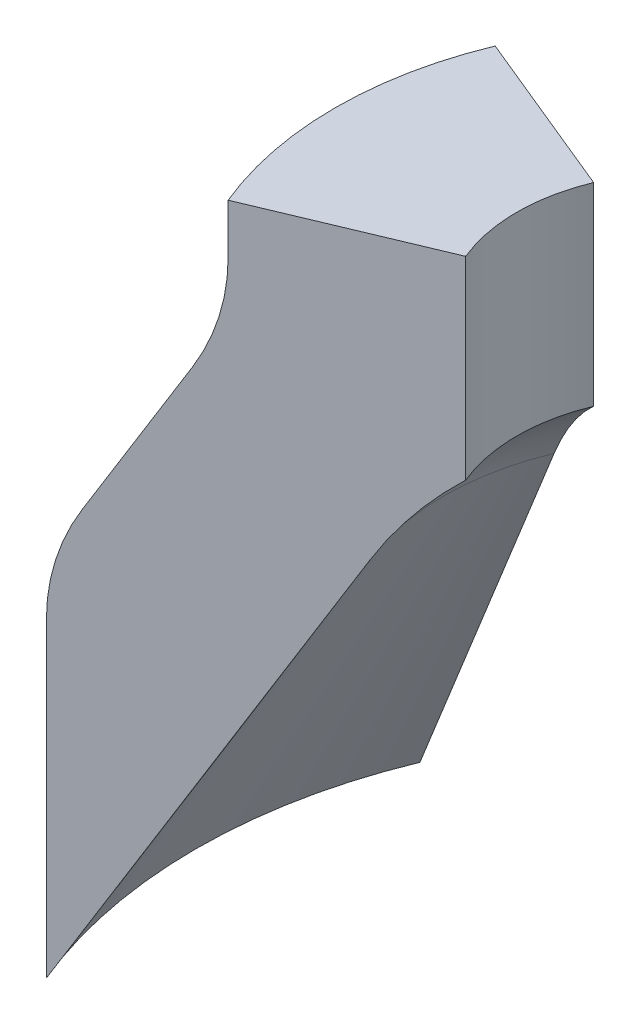
ISO-10303-21;
HEADER;
FILE_DESCRIPTION(('STEP AP214'),'2;1');
FILE_NAME('part.step','',(''),(''),'','','');
FILE_SCHEMA(('AUTOMOTIVE_DESIGN { 1 0 10303 214 1 1 1 1 }'));
ENDSEC;
DATA;
#1=APPLICATION_CONTEXT('core data for automotive mechanical design processes');
#2=APPLICATION_PROTOCOL_DEFINITION('international standard','automotive_design',2000,#1);
#3=PRODUCT_CONTEXT('',#1,'mechanical');
#4=PRODUCT('Part','Part','',(#3));
#5=PRODUCT_RELATED_PRODUCT_CATEGORY('part','',(#4));
#6=PRODUCT_DEFINITION_FORMATION('','',#4);
#7=PRODUCT_DEFINITION_CONTEXT('part definition',#1,'design');
#8=PRODUCT_DEFINITION('design','',#6,#7);
#9=PRODUCT_DEFINITION_SHAPE('','',#8);
#10=(LENGTH_UNIT() NAMED_UNIT(*) SI_UNIT(.MILLI.,.METRE.));
#11=(NAMED_UNIT(*) PLANE_ANGLE_UNIT() SI_UNIT($,.RADIAN.));
#12=(NAMED_UNIT(*) SI_UNIT($,.STERADIAN.) SOLID_ANGLE_UNIT());
#13=UNCERTAINTY_MEASURE_WITH_UNIT(LENGTH_MEASURE(1.E-05),#10,'distance_accuracy_value','');
#14=(GEOMETRIC_REPRESENTATION_CONTEXT(3) GLOBAL_UNCERTAINTY_ASSIGNED_CONTEXT((#13)) GLOBAL_UNIT_ASSIGNED_CONTEXT((#10,
#11,#12)) REPRESENTATION_CONTEXT('',''));
#15=CARTESIAN_POINT('',(0.,0.,0.));
#16=DIRECTION('',(0.,0.,1.));
#17=DIRECTION('',(1.,0.,0.));
#18=AXIS2_PLACEMENT_3D('',#15,#16,#17);
#19=CARTESIAN_POINT('',(0.,18.1196214310934,0.));
#20=DIRECTION('',(0.,1.,0.));
#21=DIRECTION('',(-1.,0.,0.));
#22=AXIS2_PLACEMENT_3D('',#19,#20,#21);
#23=TOROIDAL_SURFACE('',#22,29.7610646475562,11.);
#24=CARTESIAN_POINT('',(0.,12.6206719069507,0.));
#25=DIRECTION('',(0.,1.,0.));
#26=DIRECTION('',(-1.,0.,0.));
#27=AXIS2_PLACEMENT_3D('',#24,#25,#26);
#28=CIRCLE('',#27,20.2341787906284);
#29=CARTESIAN_POINT('',(-18.6939436418356,12.6206719069507,-7.74328499068661));
#30=VERTEX_POINT('',#29);
#31=CARTESIAN_POINT('',(-18.6939436418356,12.6206719069507,7.74328499068661));
#32=VERTEX_POINT('',#31);
#33=EDGE_CURVE('E358',#30,#32,#28,.T.);
#34=ORIENTED_EDGE('',*,*,#33,.T.);
#35=CARTESIAN_POINT('',(-27.4956384936224,18.1196214310934,11.3890663701662));
#36=DIRECTION('',(-0.382683432365091,0.,-0.923879532511287));
#37=DIRECTION('',(-0.923879532511287,0.,0.382683432365091));
#38=AXIS2_PLACEMENT_3D('',#35,#36,#37);
#39=CIRCLE('',#38,11.);
#40=CARTESIAN_POINT('',(-17.3329636359983,18.1196214310934,7.17954861415018));
#41=VERTEX_POINT('',#40);
#42=EDGE_CURVE('E290',#41,#32,#39,.T.);
#43=ORIENTED_EDGE('',*,*,#42,.F.);
#44=CARTESIAN_POINT('',(0.,18.1196214310934,0.));
#45=DIRECTION('',(0.,1.,0.));
#46=DIRECTION('',(-1.,0.,0.));
#47=AXIS2_PLACEMENT_3D('',#44,#45,#46);
#48=CIRCLE('',#47,18.7610646475562);
#49=CARTESIAN_POINT('',(-17.3329636359983,18.1196214310934,-7.17954861415018));
#50=VERTEX_POINT('',#49);
#51=EDGE_CURVE('E63',#50,#41,#48,.T.);
#52=ORIENTED_EDGE('',*,*,#51,.F.);
#53=CARTESIAN_POINT('',(-27.4956384936224,18.1196214310934,-11.3890663701662));
#54=DIRECTION('',(0.382683432365091,0.,-0.923879532511287));
#55=DIRECTION('',(-0.923879532511287,0.,-0.382683432365091));
#56=AXIS2_PLACEMENT_3D('',#53,#54,#55);
#57=CIRCLE('',#56,11.);
#58=EDGE_CURVE('E317',#50,#30,#57,.T.);
#59=ORIENTED_EDGE('',*,*,#58,.T.);
#60=EDGE_LOOP('',(#34,#43,#52,#59));
#61=FACE_BOUND('',#60,.T.);
#62=ADVANCED_FACE('F36',(#61),#23,.F.);
#63=CARTESIAN_POINT('',(0.,12.6206719069507,0.));
#64=DIRECTION('',(0.,-1.,0.));
#65=DIRECTION('',(1.,0.,0.));
#66=AXIS2_PLACEMENT_3D('',#63,#64,#65);
#67=CONICAL_SURFACE('',#66,20.2341787906284,0.523488507740986);
#68=CARTESIAN_POINT('',(0.,4.76781118512612,0.));
#69=DIRECTION('',(0.,1.,0.));
#70=DIRECTION('',(-1.,0.,0.));
#71=AXIS2_PLACEMENT_3D('',#68,#69,#70);
#72=CIRCLE('',#71,24.7668755582752);
#73=CARTESIAN_POINT('',(-22.8816094125445,4.76781118512613,-9.47787294759981));
#74=VERTEX_POINT('',#73);
#75=CARTESIAN_POINT('',(-22.8816094125445,4.76781118512613,9.47787294759981));
#76=VERTEX_POINT('',#75);
#77=EDGE_CURVE('E356',#74,#76,#72,.T.);
#78=ORIENTED_EDGE('',*,*,#77,.T.);
#79=DIRECTION('',(-0.461851537788009,-0.866080532447982,0.191305170754664));
#80=VECTOR('',#79,1.);
#81=CARTESIAN_POINT('',(-22.8816094125445,4.76781118512613,9.47787294759981));
#82=LINE('',#81,#80);
#83=EDGE_CURVE('E293',#32,#76,#82,.T.);
#84=ORIENTED_EDGE('',*,*,#83,.F.);
#85=ORIENTED_EDGE('',*,*,#33,.F.);
#86=DIRECTION('',(-0.461851537788009,-0.866080532447982,-0.191305170754664));
#87=VECTOR('',#86,1.);
#88=CARTESIAN_POINT('',(-22.8816094125445,4.76781118512613,-9.47787294759981));
#89=LINE('',#88,#87);
#90=EDGE_CURVE('E319',#30,#74,#89,.T.);
#91=ORIENTED_EDGE('',*,*,#90,.T.);
#92=EDGE_LOOP('',(#78,#84,#85,#91));
#93=FACE_BOUND('',#92,.T.);
#94=ADVANCED_FACE('F38',(#93),#67,.T.);
#95=CARTESIAN_POINT('',(0.,-0.73113833901656,0.));
#96=DIRECTION('',(0.,1.,0.));
#97=DIRECTION('',(-1.,0.,0.));
#98=AXIS2_PLACEMENT_3D('',#95,#96,#97);
#99=TOROIDAL_SURFACE('',#98,15.2399897013474,11.);
#100=CARTESIAN_POINT('',(0.,-0.731138339016564,0.));
#101=DIRECTION('',(0.,1.,0.));
#102=DIRECTION('',(-1.,0.,0.));
#103=AXIS2_PLACEMENT_3D('',#100,#101,#102);
#104=CIRCLE('',#103,26.2399897013474);
#105=CARTESIAN_POINT('',(-24.2425894183818,-0.731138339016556,-10.0416093241362));
#106=VERTEX_POINT('',#105);
#107=CARTESIAN_POINT('',(-24.2425894183818,-0.731138339016556,10.0416093241362));
#108=VERTEX_POINT('',#107);
#109=EDGE_CURVE('E354',#106,#108,#104,.T.);
#110=ORIENTED_EDGE('',*,*,#109,.T.);
#111=CARTESIAN_POINT('',(-14.0799145607576,-0.731138339016556,5.83209156812024));
#112=DIRECTION('',(0.382683432365091,0.,0.923879532511287));
#113=DIRECTION('',(0.923879532511287,0.,-0.382683432365091));
#114=AXIS2_PLACEMENT_3D('',#111,#112,#113);
#115=CIRCLE('',#114,11.);
#116=EDGE_CURVE('E296',#76,#108,#115,.T.);
#117=ORIENTED_EDGE('',*,*,#116,.F.);
#118=ORIENTED_EDGE('',*,*,#77,.F.);
#119=CARTESIAN_POINT('',(-14.0799145607576,-0.731138339016556,-5.83209156812024));
#120=DIRECTION('',(-0.382683432365091,0.,0.923879532511287));
#121=DIRECTION('',(0.923879532511287,0.,0.382683432365091));
#122=AXIS2_PLACEMENT_3D('',#119,#120,#121);
#123=CIRCLE('',#122,11.);
#124=EDGE_CURVE('E322',#74,#106,#123,.T.);
#125=ORIENTED_EDGE('',*,*,#124,.T.);
#126=EDGE_LOOP('',(#110,#117,#118,#125));
#127=FACE_BOUND('',#126,.T.);
#128=ADVANCED_FACE('F516',(#127),#99,.T.);
#129=CARTESIAN_POINT('',(0.,0.,0.));
#130=DIRECTION('',(0.,1.,0.));
#131=DIRECTION('',(-1.,0.,0.));
#132=AXIS2_PLACEMENT_3D('',#129,#130,#131);
#133=CYLINDRICAL_SURFACE('',#132,26.2399897013474);
#134=CARTESIAN_POINT('',(0.,-17.4474580380208,0.));
#135=DIRECTION('',(0.,1.,0.));
#136=DIRECTION('',(-1.,0.,0.));
#137=AXIS2_PLACEMENT_3D('',#134,#135,#136);
#138=CIRCLE('',#137,26.2399897013474);
#139=CARTESIAN_POINT('',(-24.2425894183818,-17.4474580380208,-10.0416093241362));
#140=VERTEX_POINT('',#139);
#141=CARTESIAN_POINT('',(-24.2425894183818,-17.4474580380208,10.0416093241362));
#142=VERTEX_POINT('',#141);
#143=EDGE_CURVE('E352',#140,#142,#138,.T.);
#144=ORIENTED_EDGE('',*,*,#143,.T.);
#145=DIRECTION('',(0.,-1.,0.));
#146=VECTOR('',#145,1.);
#147=CARTESIAN_POINT('',(-24.2425894183818,-17.4474580380208,10.0416093241362));
#148=LINE('',#147,#146);
#149=EDGE_CURVE('E299',#108,#142,#148,.T.);
#150=ORIENTED_EDGE('',*,*,#149,.F.);
#151=ORIENTED_EDGE('',*,*,#109,.F.);
#152=DIRECTION('',(0.,-1.,0.));
#153=VECTOR('',#152,1.);
#154=CARTESIAN_POINT('',(-24.2425894183818,-17.4474580380208,-10.0416093241362));
#155=LINE('',#154,#153);
#156=EDGE_CURVE('E325',#106,#140,#155,.T.);
#157=ORIENTED_EDGE('',*,*,#156,.T.);
#158=EDGE_LOOP('',(#144,#150,#151,#157));
#159=FACE_BOUND('',#158,.T.);
#160=ADVANCED_FACE('F513',(#159),#133,.T.);
#161=CARTESIAN_POINT('',(0.,-17.4474580380208,0.));
#162=DIRECTION('',(0.,-1.,0.));
#163=DIRECTION('',(1.,0.,0.));
#164=AXIS2_PLACEMENT_3D('',#161,#162,#163);
#165=CONICAL_SURFACE('',#164,26.2399897013474,0.523488507740983);
#166=CARTESIAN_POINT('',(0.,5.64854165133556,0.));
#167=DIRECTION('',(0.,1.,0.));
#168=DIRECTION('',(-1.,0.,0.));
#169=AXIS2_PLACEMENT_3D('',#166,#167,#168);
#170=CIRCLE('',#169,12.9089035092073);
#171=CARTESIAN_POINT('',(-11.9262717393197,5.64854165133557,-4.9400235029732));
#172=VERTEX_POINT('',#171);
#173=CARTESIAN_POINT('',(-11.9262717393197,5.64854165133557,4.9400235029732));
#174=VERTEX_POINT('',#173);
#175=EDGE_CURVE('E350',#172,#174,#170,.T.);
#176=ORIENTED_EDGE('',*,*,#175,.T.);
#177=DIRECTION('',(0.461851537788007,0.866080532447983,-0.191305170754663));
#178=VECTOR('',#177,1.);
#179=CARTESIAN_POINT('',(-24.2425894183818,-17.4474580380208,10.0416093241362));
#180=LINE('',#179,#178);
#181=EDGE_CURVE('E302',#142,#174,#180,.T.);
#182=ORIENTED_EDGE('',*,*,#181,.F.);
#183=ORIENTED_EDGE('',*,*,#143,.F.);
#184=DIRECTION('',(0.461851537788007,0.866080532447983,0.191305170754663));
#185=VECTOR('',#184,1.);
#186=CARTESIAN_POINT('',(-24.2425894183818,-17.4474580380208,-10.0416093241362));
#187=LINE('',#186,#185);
#188=EDGE_CURVE('E328',#140,#172,#187,.T.);
#189=ORIENTED_EDGE('',*,*,#188,.T.);
#190=EDGE_LOOP('',(#176,#182,#183,#189));
#191=FACE_BOUND('',#190,.T.);
#192=ADVANCED_FACE('F509',(#191),#165,.F.);
#193=CARTESIAN_POINT('',(0.,-3.66090111635775,0.));
#194=DIRECTION('',(0.,1.,0.));
#195=DIRECTION('',(-1.,0.,0.));
#196=AXIS2_PLACEMENT_3D('',#193,#194,#195);
#197=DEGENERATE_TOROIDAL_SURFACE('',#196,3.21963126821365,18.6224423401291,.F.);
#198=CARTESIAN_POINT('',(0.,10.4057850554509,0.));
#199=DIRECTION('',(0.,1.,0.));
#200=DIRECTION('',(-1.,0.,0.));
#201=AXIS2_PLACEMENT_3D('',#198,#199,#200);
#202=CIRCLE('',#201,8.98379853062893);
#203=CARTESIAN_POINT('',(-8.29994758665304,10.4057850554509,-3.43795085737754));
#204=VERTEX_POINT('',#203);
#205=CARTESIAN_POINT('',(-8.29994758665304,10.4057850554509,3.43795085737754));
#206=VERTEX_POINT('',#205);
#207=EDGE_CURVE('E348',#204,#206,#202,.T.);
#208=ORIENTED_EDGE('',*,*,#207,.T.);
#209=CARTESIAN_POINT('',(2.97455143093594,-3.66090111635775,-1.23209954466997));
#210=DIRECTION('',(-0.382683432365091,0.,-0.923879532511287));
#211=DIRECTION('',(0.923879532511287,0.,-0.382683432365091));
#212=AXIS2_PLACEMENT_3D('',#209,#210,#211);
#213=CIRCLE('',#212,18.6224423401291);
#214=EDGE_CURVE('E305',#174,#206,#213,.T.);
#215=ORIENTED_EDGE('',*,*,#214,.F.);
#216=ORIENTED_EDGE('',*,*,#175,.F.);
#217=CARTESIAN_POINT('',(2.97455143093594,-3.66090111635775,1.23209954466997));
#218=DIRECTION('',(0.382683432365091,0.,-0.923879532511287));
#219=DIRECTION('',(0.923879532511287,0.,0.382683432365091));
#220=AXIS2_PLACEMENT_3D('',#217,#218,#219);
#221=CIRCLE('',#220,18.6224423401291);
#222=EDGE_CURVE('E331',#172,#204,#221,.T.);
#223=ORIENTED_EDGE('',*,*,#222,.T.);
#224=EDGE_LOOP('',(#208,#215,#216,#223));
#225=FACE_BOUND('',#224,.T.);
#226=ADVANCED_FACE('F505',(#225),#197,.T.);
#227=CARTESIAN_POINT('',(0.,0.,0.));
#228=DIRECTION('',(0.,1.,0.));
#229=DIRECTION('',(-1.,0.,0.));
#230=AXIS2_PLACEMENT_3D('',#227,#228,#229);
#231=CYLINDRICAL_SURFACE('',#230,8.98379853062893);
#232=CARTESIAN_POINT('',(0.,20.8250605784363,0.));
#233=DIRECTION('',(0.,1.,0.));
#234=DIRECTION('',(-1.,0.,0.));
#235=AXIS2_PLACEMENT_3D('',#232,#233,#234);
#236=CIRCLE('',#235,8.98379853062894);
#237=CARTESIAN_POINT('',(-8.29994758665304,20.8250605784363,-3.43795085737754));
#238=VERTEX_POINT('',#237);
#239=CARTESIAN_POINT('',(-8.29994758665304,20.8250605784363,3.43795085737754));
#240=VERTEX_POINT('',#239);
#241=EDGE_CURVE('E346',#238,#240,#236,.T.);
#242=ORIENTED_EDGE('',*,*,#241,.T.);
#243=DIRECTION('',(0.,1.,0.));
#244=VECTOR('',#243,1.);
#245=CARTESIAN_POINT('',(-8.29994758665304,20.8250605784363,3.43795085737754));
#246=LINE('',#245,#244);
#247=EDGE_CURVE('E308',#206,#240,#246,.T.);
#248=ORIENTED_EDGE('',*,*,#247,.F.);
#249=ORIENTED_EDGE('',*,*,#207,.F.);
#250=DIRECTION('',(0.,1.,0.));
#251=VECTOR('',#250,1.);
#252=CARTESIAN_POINT('',(-8.29994758665304,20.8250605784363,-3.43795085737754));
#253=LINE('',#252,#251);
#254=EDGE_CURVE('E334',#204,#238,#253,.T.);
#255=ORIENTED_EDGE('',*,*,#254,.T.);
#256=EDGE_LOOP('',(#242,#248,#249,#255));
#257=FACE_BOUND('',#256,.T.);
#258=ADVANCED_FACE('F501',(#257),#231,.F.);
#259=CARTESIAN_POINT('',(0.,20.8250605784363,0.));
#260=DIRECTION('',(0.,-1.,0.));
#261=DIRECTION('',(1.,0.,0.));
#262=AXIS2_PLACEMENT_3D('',#259,#260,#261);
#263=CONICAL_SURFACE('',#262,8.98379853062894,1.56760914231929);
#264=CARTESIAN_POINT('',(0.,20.7938985221382,0.));
#265=DIRECTION('',(0.,1.,0.));
#266=DIRECTION('',(-1.,0.,0.));
#267=AXIS2_PLACEMENT_3D('',#264,#265,#266);
#268=CIRCLE('',#267,18.7610646475562);
#269=CARTESIAN_POINT('',(-17.3329636359983,20.7938985221382,-7.17954861415018));
#270=VERTEX_POINT('',#269);
#271=CARTESIAN_POINT('',(-17.3329636359983,20.7938985221382,7.17954861415018));
#272=VERTEX_POINT('',#271);
#273=EDGE_CURVE('E344',#270,#272,#268,.T.);
#274=ORIENTED_EDGE('',*,*,#273,.T.);
#275=DIRECTION('',(-0.923874840064187,-0.00318717907963367,0.382681488689861));
#276=VECTOR('',#275,1.);
#277=CARTESIAN_POINT('',(-17.3329636359983,20.7938985221382,7.17954861415018));
#278=LINE('',#277,#276);
#279=EDGE_CURVE('E311',#240,#272,#278,.T.);
#280=ORIENTED_EDGE('',*,*,#279,.F.);
#281=ORIENTED_EDGE('',*,*,#241,.F.);
#282=DIRECTION('',(-0.923874840064187,-0.00318717907963367,-0.382681488689861));
#283=VECTOR('',#282,1.);
#284=CARTESIAN_POINT('',(-17.3329636359983,20.7938985221382,-7.17954861415018));
#285=LINE('',#284,#283);
#286=EDGE_CURVE('E337',#238,#270,#285,.T.);
#287=ORIENTED_EDGE('',*,*,#286,.T.);
#288=EDGE_LOOP('',(#274,#280,#281,#287));
#289=FACE_BOUND('',#288,.T.);
#290=ADVANCED_FACE('F497',(#289),#263,.T.);
#291=CARTESIAN_POINT('',(0.,0.,0.));
#292=DIRECTION('',(0.,1.,0.));
#293=DIRECTION('',(-1.,0.,0.));
#294=AXIS2_PLACEMENT_3D('',#291,#292,#293);
#295=CYLINDRICAL_SURFACE('',#294,18.7610646475562);
#296=DIRECTION('',(0.,-1.,0.));
#297=VECTOR('',#296,1.);
#298=CARTESIAN_POINT('',(-17.3329636359983,18.1196214310934,-7.17954861415018));
#299=LINE('',#298,#297);
#300=EDGE_CURVE('E340',#270,#50,#299,.T.);
#301=ORIENTED_EDGE('',*,*,#300,.T.);
#302=ORIENTED_EDGE('',*,*,#51,.T.);
#303=DIRECTION('',(0.,-1.,0.));
#304=VECTOR('',#303,1.);
#305=CARTESIAN_POINT('',(-17.3329636359983,18.1196214310934,7.17954861415018));
#306=LINE('',#305,#304);
#307=EDGE_CURVE('E314',#272,#41,#306,.T.);
#308=ORIENTED_EDGE('',*,*,#307,.F.);
#309=ORIENTED_EDGE('',*,*,#273,.F.);
#310=EDGE_LOOP('',(#301,#302,#308,#309));
#311=FACE_BOUND('',#310,.T.);
#312=ADVANCED_FACE('F491',(#311),#295,.T.);
#313=CARTESIAN_POINT('',(-27.4956384936224,18.1196214310934,-11.3890663701662));
#314=DIRECTION('',(0.382683432365091,0.,-0.923879532511287));
#315=DIRECTION('',(-0.923879532511287,0.,-0.382683432365091));
#316=AXIS2_PLACEMENT_3D('',#313,#314,#315);
#317=PLANE('',#316);
#318=ORIENTED_EDGE('',*,*,#58,.F.);
#319=ORIENTED_EDGE('',*,*,#300,.F.);
#320=ORIENTED_EDGE('',*,*,#286,.F.);
#321=ORIENTED_EDGE('',*,*,#254,.F.);
#322=ORIENTED_EDGE('',*,*,#222,.F.);
#323=ORIENTED_EDGE('',*,*,#188,.F.);
#324=ORIENTED_EDGE('',*,*,#156,.F.);
#325=ORIENTED_EDGE('',*,*,#124,.F.);
#326=ORIENTED_EDGE('',*,*,#90,.F.);
#327=EDGE_LOOP('',(#318,#319,#320,#321,#322,#323,#324,#325,#326));
#328=FACE_BOUND('',#327,.T.);
#329=ADVANCED_FACE('F487',(#328),#317,.T.);
#330=CARTESIAN_POINT('',(-27.4956384936224,18.1196214310934,11.3890663701662));
#331=DIRECTION('',(-0.382683432365091,0.,-0.923879532511287));
#332=DIRECTION('',(-0.923879532511287,0.,0.382683432365091));
#333=AXIS2_PLACEMENT_3D('',#330,#331,#332);
#334=PLANE('',#333);
#335=ORIENTED_EDGE('',*,*,#42,.T.);
#336=ORIENTED_EDGE('',*,*,#83,.T.);
#337=ORIENTED_EDGE('',*,*,#116,.T.);
#338=ORIENTED_EDGE('',*,*,#149,.T.);
#339=ORIENTED_EDGE('',*,*,#181,.T.);
#340=ORIENTED_EDGE('',*,*,#214,.T.);
#341=ORIENTED_EDGE('',*,*,#247,.T.);
#342=ORIENTED_EDGE('',*,*,#279,.T.);
#343=ORIENTED_EDGE('',*,*,#307,.T.);
#344=EDGE_LOOP('',(#335,#336,#337,#338,#339,#340,#341,#342,#343));
#345=FACE_BOUND('',#344,.T.);
#346=ADVANCED_FACE('F485',(#345),#334,.F.);
#347=CLOSED_SHELL('',(#62,#94,#128,#160,#192,#226,#258,#290,#312,#329,#346));
#348=CARTESIAN_POINT('',(0.,0.,0.));
#349=DIRECTION('',(0.,1.,0.));
#350=DIRECTION('',(-1.,0.,0.));
#351=AXIS2_PLACEMENT_3D('',#348,#349,#350);
#352=CYLINDRICAL_SURFACE('',#351,11.4837985306289);
#353=CARTESIAN_POINT('',(-11.4625851695711,18.3170798925325,-0.69768898687262));
#354=CARTESIAN_POINT('',(-11.4625798981081,18.3082557543555,-0.697775593635424));
#355=CARTESIAN_POINT('',(-11.4625746267106,18.2994316160094,-0.697862183156374));
#356=CARTESIAN_POINT('',(-11.4625640840463,18.2817833389788,-0.698035327714564));
#357=CARTESIAN_POINT('',(-11.4625588127797,18.2729592002943,-0.698121882751805));
#358=CARTESIAN_POINT('',(-11.4625535415784,18.2641350614406,-0.69820842054719));
#359=B_SPLINE_CURVE_WITH_KNOTS('',3,(#353,#354,#355,#356,#357,#358),.UNSPECIFIED.,.F.,.F.,(4,2,
4),(0.,0.0264736942597327,0.0529473885194721),.UNSPECIFIED.);
#360=CARTESIAN_POINT('',(-11.462585169569,18.3170798925325,-0.697688986873041));
#361=VERTEX_POINT('',#360);
#362=CARTESIAN_POINT('',(-11.4625535415784,18.2641350614406,-0.698208420547165));
#363=VERTEX_POINT('',#362);
#364=EDGE_CURVE('E204',#361,#363,#359,.T.);
#365=ORIENTED_EDGE('',*,*,#364,.F.);
#366=CARTESIAN_POINT('',(0.,18.3170798925324,0.));
#367=DIRECTION('',(0.,1.,0.));
#368=DIRECTION('',(-1.,0.,0.));
#369=AXIS2_PLACEMENT_3D('',#366,#367,#368);
#370=CIRCLE('',#369,11.4837985306289);
#371=CARTESIAN_POINT('',(-11.2532578830517,18.3170798925325,-2.28950119231474));
#372=VERTEX_POINT('',#371);
#373=EDGE_CURVE('E267',#372,#361,#370,.T.);
#374=ORIENTED_EDGE('',*,*,#373,.F.);
#375=DIRECTION('',(0.,1.,0.));
#376=VECTOR('',#375,1.);
#377=CARTESIAN_POINT('',(-11.2532578830517,11.5037526074365,-2.28950119231474));
#378=LINE('',#377,#376);
#379=CARTESIAN_POINT('',(-11.2532578830517,11.5037526074365,-2.28950119231474));
#380=VERTEX_POINT('',#379);
#381=EDGE_CURVE('E435',#380,#372,#378,.T.);
#382=ORIENTED_EDGE('',*,*,#381,.F.);
#383=CARTESIAN_POINT('',(0.,11.5037526074365,0.));
#384=DIRECTION('',(0.,1.,0.));
#385=DIRECTION('',(-1.,0.,0.));
#386=AXIS2_PLACEMENT_3D('',#383,#384,#385);
#387=CIRCLE('',#386,11.4837985306289);
#388=CARTESIAN_POINT('',(-11.2532578830517,11.5037526074365,2.28950119231474));
#389=VERTEX_POINT('',#388);
#390=EDGE_CURVE('E273',#380,#389,#387,.T.);
#391=ORIENTED_EDGE('',*,*,#390,.T.);
#392=DIRECTION('',(0.,1.,0.));
#393=VECTOR('',#392,1.);
#394=CARTESIAN_POINT('',(-11.2532578830517,11.5037526074365,2.28950119231474));
#395=LINE('',#394,#393);
#396=CARTESIAN_POINT('',(-11.2532578830517,18.3170798925325,2.28950119231474));
#397=VERTEX_POINT('',#396);
#398=EDGE_CURVE('E446',#389,#397,#395,.T.);
#399=ORIENTED_EDGE('',*,*,#398,.T.);
#400=CARTESIAN_POINT('',(-11.462585169569,18.3170798925325,0.697688986873041));
#401=VERTEX_POINT('',#400);
#402=EDGE_CURVE('E210',#401,#397,#370,.T.);
#403=ORIENTED_EDGE('',*,*,#402,.F.);
#404=CARTESIAN_POINT('',(-11.4625535415784,18.2641350614406,0.698208420547138));
#405=CARTESIAN_POINT('',(-11.4625588127797,18.2729592002943,0.698121882751777));
#406=CARTESIAN_POINT('',(-11.4625640840463,18.2817833389788,0.698035327714554));
#407=CARTESIAN_POINT('',(-11.4625746267106,18.2994316160094,0.697862183156387));
#408=CARTESIAN_POINT('',(-11.4625798981081,18.3082557543555,0.697775593635442));
#409=CARTESIAN_POINT('',(-11.4625851695711,18.3170798925325,0.697688986872636));
#410=B_SPLINE_CURVE_WITH_KNOTS('',3,(#404,#405,#406,#407,#408,#409),.UNSPECIFIED.,.F.,.F.,(4,2,
4),(0.,0.0264736942597388,0.0529473885194714),.UNSPECIFIED.);
#411=CARTESIAN_POINT('',(-11.4625535415784,18.2641350614406,0.698208420547165));
#412=VERTEX_POINT('',#411);
#413=EDGE_CURVE('E202',#412,#401,#410,.T.);
#414=ORIENTED_EDGE('',*,*,#413,.F.);
#415=CARTESIAN_POINT('',(0.,18.3036785247568,0.));
#416=DIRECTION('',(0.00344977477050115,-0.999994049509312,0.));
#417=DIRECTION('',(0.999994049509312,0.00344977477050115,0.));
#418=AXIS2_PLACEMENT_3D('',#415,#416,#417);
#419=ELLIPSE('',#418,11.4838668652718,11.4837985306289);
#420=EDGE_CURVE('E191',#412,#363,#419,.T.);
#421=ORIENTED_EDGE('',*,*,#420,.T.);
#422=EDGE_LOOP('',(#365,#374,#382,#391,#399,#403,#414,#421));
#423=FACE_BOUND('',#422,.T.);
#424=ADVANCED_FACE('F208',(#423),#352,.T.);
#425=CARTESIAN_POINT('',(0.,18.3170798925324,0.));
#426=DIRECTION('',(0.,-1.,0.));
#427=DIRECTION('',(1.,0.,0.));
#428=AXIS2_PLACEMENT_3D('',#425,#426,#427);
#429=CONICAL_SURFACE('',#428,11.4837985306289,1.56760914231928);
#430=CARTESIAN_POINT('',(-11.4105498393097,18.3172806538364,0.483963593978391));
#431=CARTESIAN_POINT('',(-11.4241550189144,18.3172280344181,0.552949417201796));
#432=CARTESIAN_POINT('',(-11.4406831249092,18.3171641880578,0.621355233227294));
#433=CARTESIAN_POINT('',(-11.4794379043555,18.3170150272682,0.756529694868394));
#434=CARTESIAN_POINT('',(-11.5016643049387,18.3169297138669,0.823298418710074));
#435=CARTESIAN_POINT('',(-11.5516521885245,18.3167386665825,0.954682160759538));
#436=CARTESIAN_POINT('',(-11.5794097797089,18.3166329470591,1.01929865620213));
#437=CARTESIAN_POINT('',(-11.6402537748046,18.3164023848177,1.14594961093553));
#438=CARTESIAN_POINT('',(-11.6733401139658,18.316277542332,1.20798410158909));
#439=CARTESIAN_POINT('',(-11.7803033906154,18.3158762585749,1.38960778391637));
#440=CARTESIAN_POINT('',(-11.8619058079241,18.3155729789965,1.5047728124125));
#441=CARTESIAN_POINT('',(-12.0432289188816,18.3149087088195,1.71968023258093));
#442=CARTESIAN_POINT('',(-12.142946020132,18.3145477296654,1.81942567492879));
#443=CARTESIAN_POINT('',(-12.3577226096007,18.3137823207993,2.00078085168342));
#444=CARTESIAN_POINT('',(-12.4727824099553,18.3133778902034,2.08239021703448));
#445=CARTESIAN_POINT('',(-12.7149852624169,18.3125402974258,2.22514188951392));
#446=CARTESIAN_POINT('',(-12.8421302139353,18.3121071307309,2.28628097249593));
#447=CARTESIAN_POINT('',(-13.1048760732057,18.3112264428274,2.38634292100166));
#448=CARTESIAN_POINT('',(-13.2404766548838,18.3107789221726,2.42526664262763));
#449=CARTESIAN_POINT('',(-13.5162766551708,18.309882963976,2.47979262163742));
#450=CARTESIAN_POINT('',(-13.656475702217,18.309434526511,2.49539675855723));
#451=CARTESIAN_POINT('',(-13.9375044946487,18.3085489392445,2.5028471014302));
#452=CARTESIAN_POINT('',(-14.0783342434557,18.3081117895043,2.4946931783434));
#453=CARTESIAN_POINT('',(-14.3566358962057,18.307259696719,2.45485704074626));
#454=CARTESIAN_POINT('',(-14.4941075653736,18.3068447552241,2.42317318601114));
#455=CARTESIAN_POINT('',(-14.7617822669225,18.3060467144064,2.33717412610578));
#456=CARTESIAN_POINT('',(-14.8919851843592,18.3056636155872,2.28285856316391));
#457=CARTESIAN_POINT('',(-15.1414110739353,18.3049375831191,2.15314456225611));
#458=CARTESIAN_POINT('',(-15.2606351530492,18.30459464542,2.07774825292074));
#459=CARTESIAN_POINT('',(-15.4847399121016,18.3039558559943,1.9080060784989));
#460=CARTESIAN_POINT('',(-15.5896197855035,18.3036600069151,1.81365914860489));
#461=CARTESIAN_POINT('',(-15.7820519433848,18.3031211460252,1.60869642533349));
#462=CARTESIAN_POINT('',(-15.8696044203602,18.3028781336274,1.49808081271432));
#463=CARTESIAN_POINT('',(-16.0160733689074,18.3024738262112,1.27703106877934));
#464=CARTESIAN_POINT('',(-16.0771126243122,18.3023063853919,1.16800265591048));
#465=CARTESIAN_POINT('',(-16.1559564521542,18.3020908665784,0.998655660830306));
#466=CARTESIAN_POINT('',(-16.1801221723123,18.3020249576013,0.941226998274327));
#467=CARTESIAN_POINT('',(-16.2241050986042,18.3019051908431,0.824720190427642));
#468=CARTESIAN_POINT('',(-16.2439217936865,18.3018513344784,0.765641852202934));
#469=CARTESIAN_POINT('',(-16.261509546991,18.3018035876728,0.705885082353683));
#470=B_SPLINE_CURVE_WITH_KNOTS('',3,(#430,#431,#432,#433,#434,#435,#436,#437,#438,#439,#440,
#441,#442,#443,#444,#445,#446,#447,#448,#449,#450,#451,#452,#453,#454,#455,#456,#457,#458,#459,
#460,#461,#462,#463,#464,#465,#466,#467,#468,#469),.UNSPECIFIED.,.F.,.F.,(4,2,2,2,2,2,2,2,2,2,2,
2,2,2,2,2,2,2,2,4),(0.,0.210875294626943,0.421740493168286,0.632457844767325,0.843172636106629,
1.2644258585558,1.6855956315449,2.10677397424182,2.52801862293774,2.94924703724358,
3.37044149911498,3.79163824867373,4.21286436177706,4.63409713405385,5.05528738765902,
5.47650131394946,5.89771056056604,6.27108994496157,6.45785560695896,6.64464320395044),.UNSPECIFIED.);
#471=CARTESIAN_POINT('',(-16.2430166278677,18.3018538125724,0.765920556466206));
#472=VERTEX_POINT('',#471);
#473=EDGE_CURVE('E212',#401,#472,#470,.T.);
#474=ORIENTED_EDGE('',*,*,#473,.F.);
#475=ORIENTED_EDGE('',*,*,#402,.T.);
#476=DIRECTION('',(-0.979919727516482,-0.00318717907963364,0.199366921813874));
#477=VECTOR('',#476,1.);
#478=CARTESIAN_POINT('',(-11.2532578830517,18.3170798925325,2.28950119231474));
#479=LINE('',#478,#477);
#480=CARTESIAN_POINT('',(-15.9346189715768,18.3018538125724,3.2419348702078));
#481=VERTEX_POINT('',#480);
#482=EDGE_CURVE('E455',#397,#481,#479,.T.);
#483=ORIENTED_EDGE('',*,*,#482,.T.);
#484=CARTESIAN_POINT('',(0.,18.3018538125724,0.));
#485=DIRECTION('',(0.,1.,0.));
#486=DIRECTION('',(-1.,0.,0.));
#487=AXIS2_PLACEMENT_3D('',#484,#485,#486);
#488=CIRCLE('',#487,16.2610646475562);
#489=EDGE_CURVE('E439',#472,#481,#488,.T.);
#490=ORIENTED_EDGE('',*,*,#489,.F.);
#491=EDGE_LOOP('',(#474,#475,#483,#490));
#492=FACE_BOUND('',#491,.T.);
#493=ADVANCED_FACE('F376',(#492),#429,.F.);
#494=CARTESIAN_POINT('',(-16.261509546991,18.3018035876728,-0.705885082353676));
#495=CARTESIAN_POINT('',(-16.2416624570913,18.3018574707023,-0.773340531922678));
#496=CARTESIAN_POINT('',(-16.2189575958589,18.3019191826251,-0.839951518772125));
#497=CARTESIAN_POINT('',(-16.1680225700448,18.3020579414023,-0.971022852057702));
#498=CARTESIAN_POINT('',(-16.1397926700551,18.3021349875223,-1.03548330130931));
#499=CARTESIAN_POINT('',(-16.0780175339032,18.3023040377738,-1.16175410830686));
#500=CARTESIAN_POINT('',(-16.0444760384902,18.3023960313796,-1.22356629248601));
#501=CARTESIAN_POINT('',(-15.9723222312366,18.3025945458202,-1.34413286238015));
#502=CARTESIAN_POINT('',(-15.9337099810114,18.3027010664785,-1.40288728523828));
#503=CARTESIAN_POINT('',(-15.8106101620159,18.3030418723916,-1.57398603842282));
#504=CARTESIAN_POINT('',(-15.718833313593,18.3032974728844,-1.68121931055006));
#505=CARTESIAN_POINT('',(-15.5186451667477,18.303860158984,-1.87867335375556));
#506=CARTESIAN_POINT('',(-15.4102371671136,18.3041672343819,-1.96889749070237));
#507=CARTESIAN_POINT('',(-15.1797987368613,18.3048270407803,-2.12988499482939));
#508=CARTESIAN_POINT('',(-15.057768026795,18.3051797727175,-2.20064796269178));
#509=CARTESIAN_POINT('',(-14.8035425996285,18.3059236362152,-2.32068907329482));
#510=CARTESIAN_POINT('',(-14.6713462854284,18.3063147738122,-2.36996383191546));
#511=CARTESIAN_POINT('',(-14.400561492965,18.3071268158127,-2.44561786760993));
#512=CARTESIAN_POINT('',(-14.2619732600759,18.3075477190739,-2.47199802279688));
#513=CARTESIAN_POINT('',(-13.9823465876484,18.3084093536177,-2.50111437674282));
#514=CARTESIAN_POINT('',(-13.8413083465075,18.3088500832994,-2.50385248113353));
#515=CARTESIAN_POINT('',(-13.5607731023041,18.3097401576513,-2.48561239765774));
#516=CARTESIAN_POINT('',(-13.4212761073633,18.3101895023669,-2.46463408487876));
#517=CARTESIAN_POINT('',(-13.1477742468459,18.3110843101007,-2.39955402351619));
#518=CARTESIAN_POINT('',(-13.0137697648153,18.3115297728462,-2.35545066305095));
#519=CARTESIAN_POINT('',(-12.7550655329018,18.3124031429193,-2.24537079481009));
#520=CARTESIAN_POINT('',(-12.6303659266245,18.312831049976,-2.17939394953815));
#521=CARTESIAN_POINT('',(-12.3938257939764,18.3136548001133,-2.02744797469658));
#522=CARTESIAN_POINT('',(-12.2819839708825,18.3140506464262,-1.94148086381726));
#523=CARTESIAN_POINT('',(-12.0743140161895,18.3147955940512,-1.75198588045826));
#524=CARTESIAN_POINT('',(-11.9784867826233,18.3151446927417,-1.64845702384296));
#525=CARTESIAN_POINT('',(-11.8055729192193,18.3157818420638,-1.42678050509582));
#526=CARTESIAN_POINT('',(-11.7284860812399,18.3160698933735,-1.30863300534893));
#527=CARTESIAN_POINT('',(-11.6028121334844,18.3165436042095,-1.07513331863334));
#528=CARTESIAN_POINT('',(-11.5519827678694,18.3167371764341,-0.960987155520591));
#529=CARTESIAN_POINT('',(-11.4889305834951,18.3169785786089,-0.785148727838616));
#530=CARTESIAN_POINT('',(-11.4701093479356,18.3170508963637,-0.72575350746377));
#531=CARTESIAN_POINT('',(-11.436947815059,18.3171786140124,-0.60571751456618));
#532=CARTESIAN_POINT('',(-11.4226080442692,18.3172340119183,-0.54507659657772));
#533=CARTESIAN_POINT('',(-11.4105498393096,18.3172806538364,-0.483963593978172));
#534=B_SPLINE_CURVE_WITH_KNOTS('',3,(#494,#495,#496,#497,#498,#499,#500,#501,#502,#503,#504,
#505,#506,#507,#508,#509,#510,#511,#512,#513,#514,#515,#516,#517,#518,#519,#520,#521,#522,#523,
#524,#525,#526,#527,#528,#529,#530,#531,#532,#533),.UNSPECIFIED.,.F.,.F.,(4,2,2,2,2,2,2,2,2,2,2,
2,2,2,2,2,2,2,2,4),(0.,0.210875296093444,0.421740495918416,0.63245784670008,0.843172637265931,
1.26442585605799,1.68559562706189,2.10677403927597,2.52801875780733,2.94924731895631,
3.37044192729782,3.79163875404821,4.21286494331991,4.63409763219189,5.05528780190186,
5.47650158232085,5.89771068428648,6.27109000804073,6.45785563845694,6.64464320372982),.UNSPECIFIED.);
#535=CARTESIAN_POINT('',(-16.2430166278677,18.3018538125724,-0.765920556466206));
#536=VERTEX_POINT('',#535);
#537=EDGE_CURVE('E198',#536,#361,#534,.T.);
#538=ORIENTED_EDGE('',*,*,#537,.F.);
#539=CARTESIAN_POINT('',(-15.9346189715768,18.3018538125724,-3.2419348702078));
#540=VERTEX_POINT('',#539);
#541=EDGE_CURVE('E277',#540,#536,#488,.T.);
#542=ORIENTED_EDGE('',*,*,#541,.F.);
#543=DIRECTION('',(-0.979919727516482,-0.00318717907963364,-0.199366921813874));
#544=VECTOR('',#543,1.);
#545=CARTESIAN_POINT('',(-11.2532578830517,18.3170798925325,-2.28950119231474));
#546=LINE('',#545,#544);
#547=EDGE_CURVE('E272',#372,#540,#546,.T.);
#548=ORIENTED_EDGE('',*,*,#547,.F.);
#549=ORIENTED_EDGE('',*,*,#373,.T.);
#550=EDGE_LOOP('',(#538,#542,#548,#549));
#551=FACE_BOUND('',#550,.T.);
#552=ADVANCED_FACE('F270',(#551),#429,.F.);
#553=CARTESIAN_POINT('',(0.,0.,0.));
#554=DIRECTION('',(0.,1.,0.));
#555=DIRECTION('',(-1.,0.,0.));
#556=AXIS2_PLACEMENT_3D('',#553,#554,#555);
#557=CYLINDRICAL_SURFACE('',#556,16.2610646475562);
#558=CARTESIAN_POINT('',(-16.2430166278677,18.3018538125724,0.765920556466206));
#559=CARTESIAN_POINT('',(-16.2430219783766,18.2928187317001,0.765807087274636));
#560=CARTESIAN_POINT('',(-16.2430273290265,18.2837836511833,0.765693589783836));
#561=CARTESIAN_POINT('',(-16.2430380306084,18.2657134908613,0.765466538203771));
#562=CARTESIAN_POINT('',(-16.2430433815403,18.2566784110559,0.765352984114507));
#563=CARTESIAN_POINT('',(-16.2430487326133,18.2476433316061,0.765239401726011));
#564=B_SPLINE_CURVE_WITH_KNOTS('',3,(#558,#559,#560,#561,#562,#563),.UNSPECIFIED.,.F.,.F.,(4,2,
4),(0.,0.0271073848292364,0.0542147696584726),.UNSPECIFIED.);
#565=CARTESIAN_POINT('',(-16.2430487326133,18.2476433316061,0.765239401725931));
#566=VERTEX_POINT('',#565);
#567=EDGE_CURVE('E11',#472,#566,#564,.T.);
#568=ORIENTED_EDGE('',*,*,#567,.F.);
#569=ORIENTED_EDGE('',*,*,#489,.T.);
#570=DIRECTION('',(0.,-1.,0.));
#571=VECTOR('',#570,1.);
#572=CARTESIAN_POINT('',(-15.9346189715768,18.3018538125724,3.2419348702078));
#573=LINE('',#572,#571);
#574=CARTESIAN_POINT('',(-15.9346189715768,18.1196214310934,3.2419348702078));
#575=VERTEX_POINT('',#574);
#576=EDGE_CURVE('E417',#481,#575,#573,.T.);
#577=ORIENTED_EDGE('',*,*,#576,.T.);
#578=CARTESIAN_POINT('',(0.,18.1196214310934,0.));
#579=DIRECTION('',(0.,1.,0.));
#580=DIRECTION('',(-1.,0.,0.));
#581=AXIS2_PLACEMENT_3D('',#578,#579,#580);
#582=CIRCLE('',#581,16.2610646475562);
#583=CARTESIAN_POINT('',(-15.9346189715768,18.1196214310934,-3.2419348702078));
#584=VERTEX_POINT('',#583);
#585=EDGE_CURVE('E438',#584,#575,#582,.T.);
#586=ORIENTED_EDGE('',*,*,#585,.F.);
#587=DIRECTION('',(0.,-1.,0.));
#588=VECTOR('',#587,1.);
#589=CARTESIAN_POINT('',(-15.9346189715768,18.3018538125724,-3.2419348702078));
#590=LINE('',#589,#588);
#591=EDGE_CURVE('E416',#540,#584,#590,.T.);
#592=ORIENTED_EDGE('',*,*,#591,.F.);
#593=ORIENTED_EDGE('',*,*,#541,.T.);
#594=CARTESIAN_POINT('',(-16.2430487326133,18.2476433316061,-0.765239401725956));
#595=CARTESIAN_POINT('',(-16.2430433815403,18.2566784110559,-0.765352984114466));
#596=CARTESIAN_POINT('',(-16.2430380306084,18.2657134908613,-0.765466538203748));
#597=CARTESIAN_POINT('',(-16.2430273290265,18.2837836511833,-0.765693589783856));
#598=CARTESIAN_POINT('',(-16.2430219783766,18.2928187317001,-0.765807087274683));
#599=CARTESIAN_POINT('',(-16.2430166278677,18.3018538125724,-0.765920556466282));
#600=B_SPLINE_CURVE_WITH_KNOTS('',3,(#594,#595,#596,#597,#598,#599),.UNSPECIFIED.,.F.,.F.,(4,2,
4),(0.,0.0271073848292369,0.0542147696584743),.UNSPECIFIED.);
#601=CARTESIAN_POINT('',(-16.2430487326133,18.2476433316061,-0.765239401725931));
#602=VERTEX_POINT('',#601);
#603=EDGE_CURVE('E50',#602,#536,#600,.T.);
#604=ORIENTED_EDGE('',*,*,#603,.F.);
#605=CARTESIAN_POINT('',(0.,18.3036785247568,0.));
#606=DIRECTION('',(0.00344977477050115,-0.999994049509312,0.));
#607=DIRECTION('',(0.999994049509312,0.00344977477050115,0.));
#608=AXIS2_PLACEMENT_3D('',#605,#606,#607);
#609=ELLIPSE('',#608,16.2611614094458,16.2610646475562);
#610=EDGE_CURVE('E359',#602,#566,#609,.F.);
#611=ORIENTED_EDGE('',*,*,#610,.T.);
#612=EDGE_LOOP('',(#568,#569,#577,#586,#592,#593,#604,#611));
#613=FACE_BOUND('',#612,.T.);
#614=ADVANCED_FACE('F363',(#613),#557,.F.);
#615=CARTESIAN_POINT('',(0.,18.1196214310934,0.));
#616=DIRECTION('',(0.,1.,0.));
#617=DIRECTION('',(-1.,0.,0.));
#618=AXIS2_PLACEMENT_3D('',#615,#616,#617);
#619=TOROIDAL_SURFACE('',#618,29.7610646475562,13.5);
#620=CARTESIAN_POINT('',(0.,11.3709106514637,0.));
#621=DIRECTION('',(0.,1.,0.));
#622=DIRECTION('',(-1.,0.,0.));
#623=AXIS2_PLACEMENT_3D('',#620,#621,#622);
#624=CIRCLE('',#623,18.0689774595085);
#625=CARTESIAN_POINT('',(-17.7062373998093,11.3709106514637,-3.60237471313311));
#626=VERTEX_POINT('',#625);
#627=CARTESIAN_POINT('',(-17.7062373998093,11.3709106514637,3.60237471313311));
#628=VERTEX_POINT('',#627);
#629=EDGE_CURVE('E288',#626,#628,#624,.T.);
#630=ORIENTED_EDGE('',*,*,#629,.F.);
#631=CARTESIAN_POINT('',(-29.163602483958,18.1196214310934,-5.93340198483997));
#632=DIRECTION('',(0.199367934417198,0.,-0.97992470462083));
#633=DIRECTION('',(0.97992470462083,0.,0.199367934417198));
#634=AXIS2_PLACEMENT_3D('',#631,#632,#633);
#635=CIRCLE('',#634,13.5);
#636=EDGE_CURVE('E410',#584,#626,#635,.T.);
#637=ORIENTED_EDGE('',*,*,#636,.F.);
#638=ORIENTED_EDGE('',*,*,#585,.T.);
#639=CARTESIAN_POINT('',(-29.163602483958,18.1196214310934,5.93340198483997));
#640=DIRECTION('',(-0.199367934417198,0.,-0.97992470462083));
#641=DIRECTION('',(0.97992470462083,0.,-0.199367934417198));
#642=AXIS2_PLACEMENT_3D('',#639,#640,#641);
#643=CIRCLE('',#642,13.5);
#644=EDGE_CURVE('E211',#575,#628,#643,.T.);
#645=ORIENTED_EDGE('',*,*,#644,.T.);
#646=EDGE_LOOP('',(#630,#637,#638,#645));
#647=FACE_BOUND('',#646,.T.);
#648=ADVANCED_FACE('F390',(#647),#619,.T.);
#649=CARTESIAN_POINT('',(0.,11.3709106514637,0.));
#650=DIRECTION('',(0.,-1.,0.));
#651=DIRECTION('',(1.,0.,0.));
#652=AXIS2_PLACEMENT_3D('',#649,#650,#651);
#653=CONICAL_SURFACE('',#652,18.0689774595085,0.523488507740985);
#654=CARTESIAN_POINT('',(0.,3.51804992963915,0.));
#655=DIRECTION('',(0.,1.,0.));
#656=DIRECTION('',(-1.,0.,0.));
#657=AXIS2_PLACEMENT_3D('',#654,#655,#656);
#658=CIRCLE('',#657,22.6016742271552);
#659=CARTESIAN_POINT('',(-22.1479389409813,3.51804992963916,-4.50604910503834));
#660=VERTEX_POINT('',#659);
#661=CARTESIAN_POINT('',(-22.1479389409813,3.51804992963916,4.50604910503834));
#662=VERTEX_POINT('',#661);
#663=EDGE_CURVE('E286',#660,#662,#658,.T.);
#664=ORIENTED_EDGE('',*,*,#663,.F.);
#665=DIRECTION('',(-0.489868771651852,-0.866080532447982,-0.0996649280084325));
#666=VECTOR('',#665,1.);
#667=CARTESIAN_POINT('',(-17.7062373998093,11.3709106514637,-3.60237471313311));
#668=LINE('',#667,#666);
#669=EDGE_CURVE('E413',#626,#660,#668,.T.);
#670=ORIENTED_EDGE('',*,*,#669,.F.);
#671=ORIENTED_EDGE('',*,*,#629,.T.);
#672=DIRECTION('',(-0.489868771651852,-0.866080532447982,0.0996649280084325));
#673=VECTOR('',#672,1.);
#674=CARTESIAN_POINT('',(-17.7062373998093,11.3709106514637,3.60237471313311));
#675=LINE('',#674,#673);
#676=EDGE_CURVE('E215',#628,#662,#675,.T.);
#677=ORIENTED_EDGE('',*,*,#676,.T.);
#678=EDGE_LOOP('',(#664,#670,#671,#677));
#679=FACE_BOUND('',#678,.T.);
#680=ADVANCED_FACE('F393',(#679),#653,.F.);
#681=CARTESIAN_POINT('',(0.,-0.73113833901656,0.));
#682=DIRECTION('',(0.,1.,0.));
#683=DIRECTION('',(-1.,0.,0.));
#684=AXIS2_PLACEMENT_3D('',#681,#682,#683);
#685=TOROIDAL_SURFACE('',#684,15.2399897013474,8.5);
#686=CARTESIAN_POINT('',(0.,-0.731138339016562,0.));
#687=DIRECTION('',(0.,1.,0.));
#688=DIRECTION('',(-1.,0.,0.));
#689=AXIS2_PLACEMENT_3D('',#686,#687,#688);
#690=CIRCLE('',#689,23.7399897013474);
#691=CARTESIAN_POINT('',(-23.2634023957943,-0.731138339016554,-4.73299270984317));
#692=VERTEX_POINT('',#691);
#693=CARTESIAN_POINT('',(-23.2634023957943,-0.731138339016554,4.73299270984317));
#694=VERTEX_POINT('',#693);
#695=EDGE_CURVE('E284',#692,#694,#690,.T.);
#696=ORIENTED_EDGE('',*,*,#695,.F.);
#697=CARTESIAN_POINT('',(-14.9340424065173,-0.731138339016555,-3.03836526729699));
#698=DIRECTION('',(-0.199367934417198,0.,0.97992470462083));
#699=DIRECTION('',(0.97992470462083,0.,0.199367934417198));
#700=AXIS2_PLACEMENT_3D('',#697,#698,#699);
#701=CIRCLE('',#700,8.5);
#702=EDGE_CURVE('E421',#660,#692,#701,.T.);
#703=ORIENTED_EDGE('',*,*,#702,.F.);
#704=ORIENTED_EDGE('',*,*,#663,.T.);
#705=CARTESIAN_POINT('',(-14.9340424065173,-0.731138339016555,3.03836526729699));
#706=DIRECTION('',(0.199367934417198,0.,0.97992470462083));
#707=DIRECTION('',(0.97992470462083,0.,-0.199367934417198));
#708=AXIS2_PLACEMENT_3D('',#705,#706,#707);
#709=CIRCLE('',#708,8.5);
#710=EDGE_CURVE('E463',#662,#694,#709,.T.);
#711=ORIENTED_EDGE('',*,*,#710,.T.);
#712=EDGE_LOOP('',(#696,#703,#704,#711));
#713=FACE_BOUND('',#712,.T.);
#714=ADVANCED_FACE('F474',(#713),#685,.F.);
#715=CARTESIAN_POINT('',(0.,0.,0.));
#716=DIRECTION('',(0.,1.,0.));
#717=DIRECTION('',(-1.,0.,0.));
#718=AXIS2_PLACEMENT_3D('',#715,#716,#717);
#719=CYLINDRICAL_SURFACE('',#718,23.7399897013474);
#720=CARTESIAN_POINT('',(0.,-8.11527296939712,0.));
#721=DIRECTION('',(0.,1.,0.));
#722=DIRECTION('',(-1.,0.,0.));
#723=AXIS2_PLACEMENT_3D('',#720,#721,#722);
#724=CIRCLE('',#723,23.7399897013474);
#725=CARTESIAN_POINT('',(-23.2634023957944,-8.11527296939711,-4.73299270984317));
#726=VERTEX_POINT('',#725);
#727=CARTESIAN_POINT('',(-23.2634023957944,-8.11527296939711,4.73299270984317));
#728=VERTEX_POINT('',#727);
#729=EDGE_CURVE('E282',#726,#728,#724,.T.);
#730=ORIENTED_EDGE('',*,*,#729,.F.);
#731=DIRECTION('',(0.,-1.,0.));
#732=VECTOR('',#731,1.);
#733=CARTESIAN_POINT('',(-23.2634023957944,-0.731138339016557,-4.73299270984317));
#734=LINE('',#733,#732);
#735=EDGE_CURVE('E423',#692,#726,#734,.T.);
#736=ORIENTED_EDGE('',*,*,#735,.F.);
#737=ORIENTED_EDGE('',*,*,#695,.T.);
#738=DIRECTION('',(0.,-1.,0.));
#739=VECTOR('',#738,1.);
#740=CARTESIAN_POINT('',(-23.2634023957944,-0.731138339016557,4.73299270984317));
#741=LINE('',#740,#739);
#742=EDGE_CURVE('E464',#694,#728,#741,.T.);
#743=ORIENTED_EDGE('',*,*,#742,.T.);
#744=EDGE_LOOP('',(#730,#736,#737,#743));
#745=FACE_BOUND('',#744,.T.);
#746=ADVANCED_FACE('F471',(#745),#719,.F.);
#747=CARTESIAN_POINT('',(0.,-8.11527296939712,0.));
#748=DIRECTION('',(0.,-1.,0.));
#749=DIRECTION('',(1.,0.,0.));
#750=AXIS2_PLACEMENT_3D('',#747,#748,#749);
#751=CONICAL_SURFACE('',#750,23.7399897013474,0.523488507740983);
#752=CARTESIAN_POINT('',(0.,6.89830290682253,0.));
#753=DIRECTION('',(0.,1.,0.));
#754=DIRECTION('',(-1.,0.,0.));
#755=AXIS2_PLACEMENT_3D('',#752,#753,#754);
#756=CIRCLE('',#755,15.0741048403272);
#757=CARTESIAN_POINT('',(-14.7714877330811,6.89830290682254,-3.00529314520432));
#758=VERTEX_POINT('',#757);
#759=CARTESIAN_POINT('',(-14.7714877330811,6.89830290682254,3.00529314520432));
#760=VERTEX_POINT('',#759);
#761=EDGE_CURVE('E275',#758,#760,#756,.T.);
#762=ORIENTED_EDGE('',*,*,#761,.F.);
#763=DIRECTION('',(0.489868771651849,0.866080532447983,0.0996649280084321));
#764=VECTOR('',#763,1.);
#765=CARTESIAN_POINT('',(-23.2634023957944,-8.11527296939711,-4.73299270984317));
#766=LINE('',#765,#764);
#767=EDGE_CURVE('E429',#726,#758,#766,.T.);
#768=ORIENTED_EDGE('',*,*,#767,.F.);
#769=ORIENTED_EDGE('',*,*,#729,.T.);
#770=DIRECTION('',(0.48986877165185,0.866080532447983,-0.0996649280084321));
#771=VECTOR('',#770,1.);
#772=CARTESIAN_POINT('',(-23.2634023957944,-8.11527296939711,4.73299270984317));
#773=LINE('',#772,#771);
#774=EDGE_CURVE('E452',#728,#760,#773,.T.);
#775=ORIENTED_EDGE('',*,*,#774,.T.);
#776=EDGE_LOOP('',(#762,#768,#769,#775));
#777=FACE_BOUND('',#776,.T.);
#778=ADVANCED_FACE('F404',(#777),#751,.T.);
#779=CARTESIAN_POINT('',(0.,-3.66090111635775,0.));
#780=DIRECTION('',(0.,1.,0.));
#781=DIRECTION('',(-1.,0.,0.));
#782=AXIS2_PLACEMENT_3D('',#779,#780,#781);
#783=DEGENERATE_TOROIDAL_SURFACE('',#782,3.21963126821365,21.1224423401291,.F.);
#784=ORIENTED_EDGE('',*,*,#390,.F.);
#785=CARTESIAN_POINT('',(3.15499621949224,-3.66090111635775,0.641891235528777));
#786=DIRECTION('',(0.199367934417198,0.,-0.97992470462083));
#787=DIRECTION('',(0.97992470462083,0.,0.199367934417198));
#788=AXIS2_PLACEMENT_3D('',#785,#786,#787);
#789=CIRCLE('',#788,21.1224423401291);
#790=EDGE_CURVE('E432',#758,#380,#789,.T.);
#791=ORIENTED_EDGE('',*,*,#790,.F.);
#792=ORIENTED_EDGE('',*,*,#761,.T.);
#793=CARTESIAN_POINT('',(3.15499621949224,-3.66090111635775,-0.641891235528777));
#794=DIRECTION('',(-0.199367934417198,0.,-0.97992470462083));
#795=DIRECTION('',(0.97992470462083,0.,-0.199367934417198));
#796=AXIS2_PLACEMENT_3D('',#793,#794,#795);
#797=CIRCLE('',#796,21.1224423401291);
#798=EDGE_CURVE('E449',#760,#389,#797,.T.);
#799=ORIENTED_EDGE('',*,*,#798,.T.);
#800=EDGE_LOOP('',(#784,#791,#792,#799));
#801=FACE_BOUND('',#800,.T.);
#802=ADVANCED_FACE('F397',(#801),#783,.F.);
#803=CARTESIAN_POINT('',(-29.163602483958,18.1196214310934,-5.93340198483997));
#804=DIRECTION('',(-0.199367934417198,0.,0.97992470462083));
#805=DIRECTION('',(0.97992470462083,0.,0.199367934417198));
#806=AXIS2_PLACEMENT_3D('',#803,#804,#805);
#807=PLANE('',#806);
#808=ORIENTED_EDGE('',*,*,#636,.T.);
#809=ORIENTED_EDGE('',*,*,#669,.T.);
#810=ORIENTED_EDGE('',*,*,#702,.T.);
#811=ORIENTED_EDGE('',*,*,#735,.T.);
#812=ORIENTED_EDGE('',*,*,#767,.T.);
#813=ORIENTED_EDGE('',*,*,#790,.T.);
#814=ORIENTED_EDGE('',*,*,#381,.T.);
#815=ORIENTED_EDGE('',*,*,#547,.T.);
#816=ORIENTED_EDGE('',*,*,#591,.T.);
#817=EDGE_LOOP('',(#808,#809,#810,#811,#812,#813,#814,#815,#816));
#818=FACE_BOUND('',#817,.T.);
#819=ADVANCED_FACE('F395',(#818),#807,.T.);
#820=CARTESIAN_POINT('',(-29.163602483958,18.1196214310934,5.93340198483997));
#821=DIRECTION('',(0.199367934417198,0.,0.97992470462083));
#822=DIRECTION('',(0.97992470462083,0.,-0.199367934417198));
#823=AXIS2_PLACEMENT_3D('',#820,#821,#822);
#824=PLANE('',#823);
#825=ORIENTED_EDGE('',*,*,#644,.F.);
#826=ORIENTED_EDGE('',*,*,#576,.F.);
#827=ORIENTED_EDGE('',*,*,#482,.F.);
#828=ORIENTED_EDGE('',*,*,#398,.F.);
#829=ORIENTED_EDGE('',*,*,#798,.F.);
#830=ORIENTED_EDGE('',*,*,#774,.F.);
#831=ORIENTED_EDGE('',*,*,#742,.F.);
#832=ORIENTED_EDGE('',*,*,#710,.F.);
#833=ORIENTED_EDGE('',*,*,#676,.F.);
#834=EDGE_LOOP('',(#825,#826,#827,#828,#829,#830,#831,#832,#833));
#835=FACE_BOUND('',#834,.T.);
#836=ADVANCED_FACE('F236',(#835),#824,.F.);
#837=CARTESIAN_POINT('',(-13.8630610758754,18.2558538018348,0.));
#838=DIRECTION('',(-0.00344977477050115,0.999994049509312,0.));
#839=DIRECTION('',(-0.999994049509312,-0.00344977477050115,0.));
#840=AXIS2_PLACEMENT_3D('',#837,#838,#839);
#841=CYLINDRICAL_SURFACE('',#840,2.5);
#842=CARTESIAN_POINT('',(-13.8718580015401,20.8058386280835,0.));
#843=DIRECTION('',(0.00344977477050115,-0.999994049509312,0.));
#844=DIRECTION('',(0.999994049509312,0.00344977477050115,0.));
#845=AXIS2_PLACEMENT_3D('',#842,#843,#844);
#846=CIRCLE('',#845,2.5);
#847=CARTESIAN_POINT('',(-11.3718728777669,20.8144630650098,0.));
#848=VERTEX_POINT('',#847);
#849=EDGE_CURVE('E205',#848,#848,#846,.T.);
#850=ORIENTED_EDGE('',*,*,#849,.F.);
#851=EDGE_LOOP('',(#850));
#852=FACE_BOUND('',#851,.T.);
#853=ORIENTED_EDGE('',*,*,#413,.T.);
#854=ORIENTED_EDGE('',*,*,#473,.T.);
#855=ORIENTED_EDGE('',*,*,#567,.T.);
#856=CARTESIAN_POINT('',(-13.8630610758754,18.2558538018348,0.));
#857=DIRECTION('',(0.00344977477050115,-0.999994049509312,0.));
#858=DIRECTION('',(0.999994049509312,0.00344977477050115,0.));
#859=AXIS2_PLACEMENT_3D('',#856,#857,#858);
#860=CIRCLE('',#859,2.5);
#861=EDGE_CURVE('E56',#566,#602,#860,.T.);
#862=ORIENTED_EDGE('',*,*,#861,.T.);
#863=ORIENTED_EDGE('',*,*,#603,.T.);
#864=ORIENTED_EDGE('',*,*,#537,.T.);
#865=ORIENTED_EDGE('',*,*,#364,.T.);
#866=EDGE_CURVE('E194',#363,#412,#860,.T.);
#867=ORIENTED_EDGE('',*,*,#866,.T.);
#868=EDGE_LOOP('',(#853,#854,#855,#862,#863,#864,#865,#867));
#869=FACE_BOUND('',#868,.T.);
#870=ADVANCED_FACE('F201',(#852,#869),#841,.F.);
#871=CARTESIAN_POINT('',(-13.8630610758754,18.2558538018348,0.));
#872=DIRECTION('',(0.00344977477050115,-0.999994049509312,0.));
#873=DIRECTION('',(0.999994049509312,0.00344977477050115,0.));
#874=AXIS2_PLACEMENT_3D('',#871,#872,#873);
#875=PLANE('',#874);
#876=ORIENTED_EDGE('',*,*,#866,.F.);
#877=ORIENTED_EDGE('',*,*,#420,.F.);
#878=EDGE_LOOP('',(#876,#877));
#879=FACE_BOUND('',#878,.T.);
#880=ADVANCED_FACE('F193',(#879),#875,.F.);
#881=ORIENTED_EDGE('',*,*,#861,.F.);
#882=ORIENTED_EDGE('',*,*,#610,.F.);
#883=EDGE_LOOP('',(#881,#882));
#884=FACE_BOUND('',#883,.T.);
#885=ADVANCED_FACE('F365',(#884),#875,.F.);
#886=CARTESIAN_POINT('',(-13.8718580015401,20.8058386280835,0.));
#887=DIRECTION('',(0.00344977477050115,-0.999994049509312,0.));
#888=DIRECTION('',(0.999994049509312,0.00344977477050115,0.));
#889=AXIS2_PLACEMENT_3D('',#886,#887,#888);
#890=PLANE('',#889);
#891=ORIENTED_EDGE('',*,*,#849,.T.);
#892=EDGE_LOOP('',(#891));
#893=FACE_BOUND('',#892,.T.);
#894=ADVANCED_FACE('F239',(#893),#890,.T.);
#895=CLOSED_SHELL('',(#424,#493,#552,#614,#648,#680,#714,#746,#778,#802,#819,#836,#870,#880,
#885,#894));
#896=ORIENTED_CLOSED_SHELL('',*,#895,.T.);
#897=BREP_WITH_VOIDS('B2',#347,(#896));
#898=ADVANCED_BREP_SHAPE_REPRESENTATION('',(#18,#897),#14);
#899=SHAPE_DEFINITION_REPRESENTATION(#9,#898);
ENDSEC;
END-ISO-10303-21;
